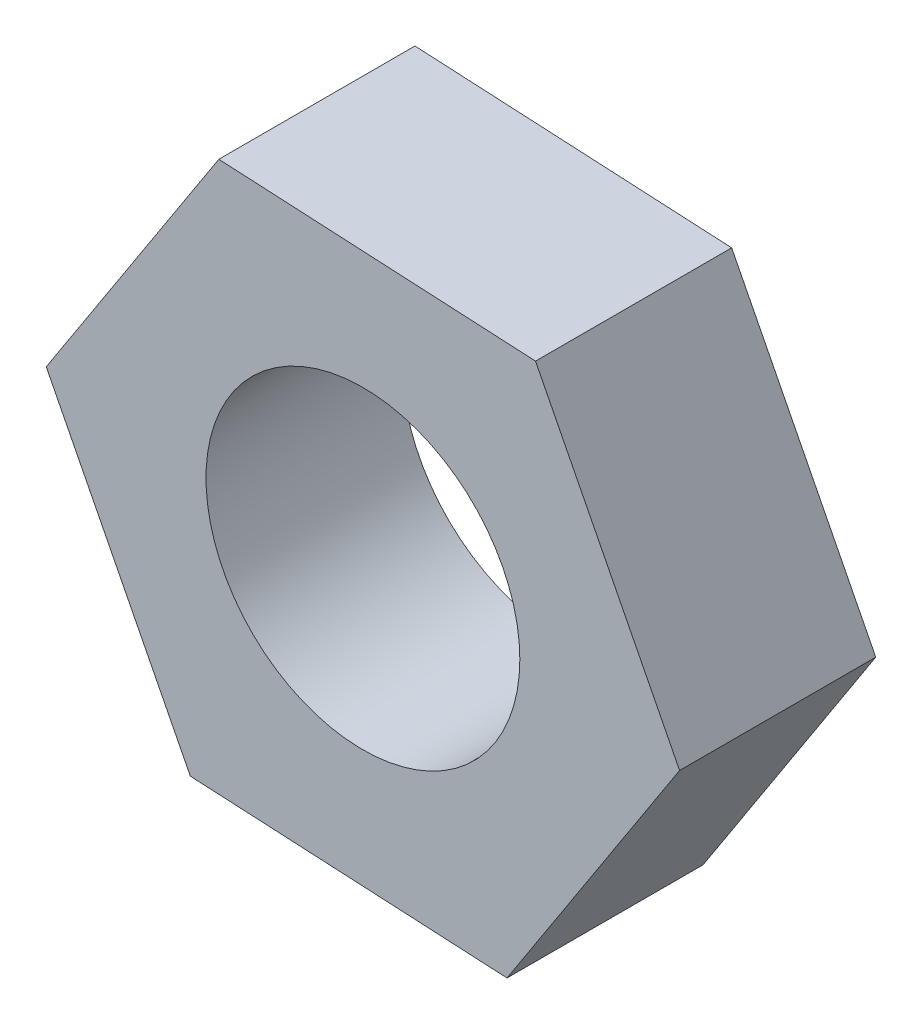
ISO-10303-21;
HEADER;
FILE_DESCRIPTION(('STEP AP214'),'2;1');
FILE_NAME('part.step','',(''),(''),'','','');
FILE_SCHEMA(('AUTOMOTIVE_DESIGN { 1 0 10303 214 1 1 1 1 }'));
ENDSEC;
DATA;
#1=APPLICATION_CONTEXT('core data for automotive mechanical design processes');
#2=APPLICATION_PROTOCOL_DEFINITION('international standard','automotive_design',2000,#1);
#3=PRODUCT_CONTEXT('',#1,'mechanical');
#4=PRODUCT('Part','Part','',(#3));
#5=PRODUCT_RELATED_PRODUCT_CATEGORY('part','',(#4));
#6=PRODUCT_DEFINITION_FORMATION('','',#4);
#7=PRODUCT_DEFINITION_CONTEXT('part definition',#1,'design');
#8=PRODUCT_DEFINITION('design','',#6,#7);
#9=PRODUCT_DEFINITION_SHAPE('','',#8);
#10=(LENGTH_UNIT() NAMED_UNIT(*) SI_UNIT(.MILLI.,.METRE.));
#11=(NAMED_UNIT(*) PLANE_ANGLE_UNIT() SI_UNIT($,.RADIAN.));
#12=(NAMED_UNIT(*) SI_UNIT($,.STERADIAN.) SOLID_ANGLE_UNIT());
#13=UNCERTAINTY_MEASURE_WITH_UNIT(LENGTH_MEASURE(1.E-05),#10,'distance_accuracy_value','');
#14=(GEOMETRIC_REPRESENTATION_CONTEXT(3) GLOBAL_UNCERTAINTY_ASSIGNED_CONTEXT((#13)) GLOBAL_UNIT_ASSIGNED_CONTEXT((#10,
#11,#12)) REPRESENTATION_CONTEXT('',''));
#15=CARTESIAN_POINT('',(0.,0.,0.));
#16=DIRECTION('',(0.,0.,1.));
#17=DIRECTION('',(1.,0.,0.));
#18=AXIS2_PLACEMENT_3D('',#15,#16,#17);
#19=CARTESIAN_POINT('',(4.03600614441625,-0.209732533402794,2.5));
#20=DIRECTION('',(-0.890806131221612,-0.454383578684337,0.));
#21=DIRECTION('',(0.454383578684337,-0.890806131221612,0.));
#22=AXIS2_PLACEMENT_3D('',#19,#20,#21);
#23=PLANE('',#22);
#24=DIRECTION('',(-0.454383578684337,0.890806131221612,0.));
#25=VECTOR('',#24,1.);
#26=CARTESIAN_POINT('',(4.03600614441625,-0.209732533402794,0.));
#27=LINE('',#26,#25);
#28=CARTESIAN_POINT('',(4.03600614441625,-0.209732533402794,0.));
#29=VERTEX_POINT('',#28);
#30=CARTESIAN_POINT('',(2.19963677413502,3.39041758419316,0.));
#31=VERTEX_POINT('',#30);
#32=EDGE_CURVE('E85',#29,#31,#27,.T.);
#33=ORIENTED_EDGE('',*,*,#32,.T.);
#34=DIRECTION('',(0.,0.,-1.));
#35=VECTOR('',#34,1.);
#36=CARTESIAN_POINT('',(2.19963677413502,3.39041758419316,2.5));
#37=LINE('',#36,#35);
#38=CARTESIAN_POINT('',(2.19963677413502,3.39041758419316,2.5));
#39=VERTEX_POINT('',#38);
#40=EDGE_CURVE('E11',#39,#31,#37,.T.);
#41=ORIENTED_EDGE('',*,*,#40,.F.);
#42=DIRECTION('',(-0.454383578684337,0.890806131221612,0.));
#43=VECTOR('',#42,1.);
#44=CARTESIAN_POINT('',(4.03600614441625,-0.209732533402794,2.5));
#45=LINE('',#44,#43);
#46=CARTESIAN_POINT('',(4.03600614441625,-0.209732533402794,2.5));
#47=VERTEX_POINT('',#46);
#48=EDGE_CURVE('E113',#47,#39,#45,.T.);
#49=ORIENTED_EDGE('',*,*,#48,.F.);
#50=DIRECTION('',(0.,0.,-1.));
#51=VECTOR('',#50,1.);
#52=CARTESIAN_POINT('',(4.03600614441625,-0.209732533402794,2.5));
#53=LINE('',#52,#51);
#54=EDGE_CURVE('E98',#47,#29,#53,.T.);
#55=ORIENTED_EDGE('',*,*,#54,.T.);
#56=EDGE_LOOP('',(#33,#41,#49,#55));
#57=FACE_BOUND('',#56,.T.);
#58=ADVANCED_FACE('F29',(#57),#23,.F.);
#59=CARTESIAN_POINT('',(2.19963677413502,3.39041758419316,2.5));
#60=DIRECTION('',(-0.0518953434076843,-0.998652528827018,0.));
#61=DIRECTION('',(0.998652528827018,-0.0518953434076843,0.));
#62=AXIS2_PLACEMENT_3D('',#59,#60,#61);
#63=PLANE('',#62);
#64=DIRECTION('',(-0.998652528827018,0.0518953434076843,0.));
#65=VECTOR('',#64,1.);
#66=CARTESIAN_POINT('',(2.19963677413502,3.39041758419316,0.));
#67=LINE('',#66,#65);
#68=CARTESIAN_POINT('',(-1.83636937028123,3.60015011759596,0.));
#69=VERTEX_POINT('',#68);
#70=EDGE_CURVE('E81',#31,#69,#67,.T.);
#71=ORIENTED_EDGE('',*,*,#70,.T.);
#72=DIRECTION('',(0.,0.,-1.));
#73=VECTOR('',#72,1.);
#74=CARTESIAN_POINT('',(-1.83636937028123,3.60015011759596,2.5));
#75=LINE('',#74,#73);
#76=CARTESIAN_POINT('',(-1.83636937028123,3.60015011759596,2.5));
#77=VERTEX_POINT('',#76);
#78=EDGE_CURVE('E36',#77,#69,#75,.T.);
#79=ORIENTED_EDGE('',*,*,#78,.F.);
#80=DIRECTION('',(-0.998652528827018,0.0518953434076843,0.));
#81=VECTOR('',#80,1.);
#82=CARTESIAN_POINT('',(2.19963677413502,3.39041758419316,2.5));
#83=LINE('',#82,#81);
#84=EDGE_CURVE('E94',#39,#77,#83,.T.);
#85=ORIENTED_EDGE('',*,*,#84,.F.);
#86=ORIENTED_EDGE('',*,*,#40,.T.);
#87=EDGE_LOOP('',(#71,#79,#85,#86));
#88=FACE_BOUND('',#87,.T.);
#89=ADVANCED_FACE('F93',(#88),#63,.F.);
#90=CARTESIAN_POINT('',(-1.83636937028123,3.60015011759596,2.5));
#91=DIRECTION('',(0.838910787813927,-0.544268950142681,0.));
#92=DIRECTION('',(0.544268950142681,0.838910787813927,0.));
#93=AXIS2_PLACEMENT_3D('',#90,#91,#92);
#94=PLANE('',#93);
#95=DIRECTION('',(-0.544268950142681,-0.838910787813927,0.));
#96=VECTOR('',#95,1.);
#97=CARTESIAN_POINT('',(-1.83636937028123,3.60015011759596,0.));
#98=LINE('',#97,#96);
#99=CARTESIAN_POINT('',(-4.03600614441625,0.209732533402808,0.));
#100=VERTEX_POINT('',#99);
#101=EDGE_CURVE('E87',#69,#100,#98,.T.);
#102=ORIENTED_EDGE('',*,*,#101,.T.);
#103=DIRECTION('',(0.,0.,-1.));
#104=VECTOR('',#103,1.);
#105=CARTESIAN_POINT('',(-4.03600614441625,0.209732533402808,2.5));
#106=LINE('',#105,#104);
#107=CARTESIAN_POINT('',(-4.03600614441625,0.209732533402808,2.5));
#108=VERTEX_POINT('',#107);
#109=EDGE_CURVE('E129',#108,#100,#106,.T.);
#110=ORIENTED_EDGE('',*,*,#109,.F.);
#111=DIRECTION('',(-0.544268950142681,-0.838910787813927,0.));
#112=VECTOR('',#111,1.);
#113=CARTESIAN_POINT('',(-1.83636937028123,3.60015011759596,2.5));
#114=LINE('',#113,#112);
#115=EDGE_CURVE('E116',#77,#108,#114,.T.);
#116=ORIENTED_EDGE('',*,*,#115,.F.);
#117=ORIENTED_EDGE('',*,*,#78,.T.);
#118=EDGE_LOOP('',(#102,#110,#116,#117));
#119=FACE_BOUND('',#118,.T.);
#120=ADVANCED_FACE('F133',(#119),#94,.F.);
#121=CARTESIAN_POINT('',(-4.03600614441625,0.209732533402808,2.5));
#122=DIRECTION('',(0.890806131221612,0.454383578684337,0.));
#123=DIRECTION('',(-0.454383578684337,0.890806131221612,0.));
#124=AXIS2_PLACEMENT_3D('',#121,#122,#123);
#125=PLANE('',#124);
#126=DIRECTION('',(0.454383578684337,-0.890806131221612,0.));
#127=VECTOR('',#126,1.);
#128=CARTESIAN_POINT('',(-4.03600614441625,0.209732533402808,0.));
#129=LINE('',#128,#127);
#130=CARTESIAN_POINT('',(-2.19963677413502,-3.39041758419316,0.));
#131=VERTEX_POINT('',#130);
#132=EDGE_CURVE('E107',#100,#131,#129,.T.);
#133=ORIENTED_EDGE('',*,*,#132,.T.);
#134=DIRECTION('',(0.,0.,-1.));
#135=VECTOR('',#134,1.);
#136=CARTESIAN_POINT('',(-2.19963677413502,-3.39041758419316,2.5));
#137=LINE('',#136,#135);
#138=CARTESIAN_POINT('',(-2.19963677413502,-3.39041758419316,2.5));
#139=VERTEX_POINT('',#138);
#140=EDGE_CURVE('E126',#139,#131,#137,.T.);
#141=ORIENTED_EDGE('',*,*,#140,.F.);
#142=DIRECTION('',(0.454383578684337,-0.890806131221612,0.));
#143=VECTOR('',#142,1.);
#144=CARTESIAN_POINT('',(-4.03600614441625,0.209732533402808,2.5));
#145=LINE('',#144,#143);
#146=EDGE_CURVE('E118',#108,#139,#145,.T.);
#147=ORIENTED_EDGE('',*,*,#146,.F.);
#148=ORIENTED_EDGE('',*,*,#109,.T.);
#149=EDGE_LOOP('',(#133,#141,#147,#148));
#150=FACE_BOUND('',#149,.T.);
#151=ADVANCED_FACE('F139',(#150),#125,.F.);
#152=CARTESIAN_POINT('',(-2.19963677413502,-3.39041758419316,2.5));
#153=DIRECTION('',(0.0518953434076844,0.998652528827018,0.));
#154=DIRECTION('',(-0.998652528827018,0.0518953434076844,0.));
#155=AXIS2_PLACEMENT_3D('',#152,#153,#154);
#156=PLANE('',#155);
#157=DIRECTION('',(0.998652528827018,-0.0518953434076844,0.));
#158=VECTOR('',#157,1.);
#159=CARTESIAN_POINT('',(-2.19963677413502,-3.39041758419316,0.));
#160=LINE('',#159,#158);
#161=CARTESIAN_POINT('',(1.83636937028122,-3.60015011759596,0.));
#162=VERTEX_POINT('',#161);
#163=EDGE_CURVE('E109',#131,#162,#160,.T.);
#164=ORIENTED_EDGE('',*,*,#163,.T.);
#165=DIRECTION('',(0.,0.,-1.));
#166=VECTOR('',#165,1.);
#167=CARTESIAN_POINT('',(1.83636937028122,-3.60015011759596,2.5));
#168=LINE('',#167,#166);
#169=CARTESIAN_POINT('',(1.83636937028122,-3.60015011759596,2.5));
#170=VERTEX_POINT('',#169);
#171=EDGE_CURVE('E123',#170,#162,#168,.T.);
#172=ORIENTED_EDGE('',*,*,#171,.F.);
#173=DIRECTION('',(0.998652528827018,-0.0518953434076844,0.));
#174=VECTOR('',#173,1.);
#175=CARTESIAN_POINT('',(-2.19963677413502,-3.39041758419316,2.5));
#176=LINE('',#175,#174);
#177=EDGE_CURVE('E48',#139,#170,#176,.T.);
#178=ORIENTED_EDGE('',*,*,#177,.F.);
#179=ORIENTED_EDGE('',*,*,#140,.T.);
#180=EDGE_LOOP('',(#164,#172,#178,#179));
#181=FACE_BOUND('',#180,.T.);
#182=ADVANCED_FACE('F142',(#181),#156,.F.);
#183=CARTESIAN_POINT('',(1.83636937028122,-3.60015011759596,2.5));
#184=DIRECTION('',(-0.838910787813927,0.544268950142682,0.));
#185=DIRECTION('',(-0.544268950142682,-0.838910787813927,0.));
#186=AXIS2_PLACEMENT_3D('',#183,#184,#185);
#187=PLANE('',#186);
#188=DIRECTION('',(0.544268950142682,0.838910787813927,0.));
#189=VECTOR('',#188,1.);
#190=CARTESIAN_POINT('',(1.83636937028122,-3.60015011759596,0.));
#191=LINE('',#190,#189);
#192=EDGE_CURVE('E111',#162,#29,#191,.T.);
#193=ORIENTED_EDGE('',*,*,#192,.T.);
#194=ORIENTED_EDGE('',*,*,#54,.F.);
#195=DIRECTION('',(0.544268950142682,0.838910787813927,0.));
#196=VECTOR('',#195,1.);
#197=CARTESIAN_POINT('',(1.83636937028122,-3.60015011759596,2.5));
#198=LINE('',#197,#196);
#199=EDGE_CURVE('E43',#170,#47,#198,.T.);
#200=ORIENTED_EDGE('',*,*,#199,.F.);
#201=ORIENTED_EDGE('',*,*,#171,.T.);
#202=EDGE_LOOP('',(#193,#194,#200,#201));
#203=FACE_BOUND('',#202,.T.);
#204=ADVANCED_FACE('F144',(#203),#187,.F.);
#205=CARTESIAN_POINT('',(4.03600614441625,-0.209732533402795,2.5));
#206=DIRECTION('',(0.,0.,-1.));
#207=DIRECTION('',(-1.,0.,0.));
#208=AXIS2_PLACEMENT_3D('',#205,#206,#207);
#209=PLANE('',#208);
#210=CARTESIAN_POINT('',(0.,0.,2.5));
#211=DIRECTION('',(0.,0.,1.));
#212=DIRECTION('',(1.,0.,0.));
#213=AXIS2_PLACEMENT_3D('',#210,#211,#212);
#214=CIRCLE('',#213,2.);
#215=CARTESIAN_POINT('',(2.,0.,2.5));
#216=VERTEX_POINT('',#215);
#217=EDGE_CURVE('E102',#216,#216,#214,.T.);
#218=ORIENTED_EDGE('',*,*,#217,.F.);
#219=EDGE_LOOP('',(#218));
#220=FACE_BOUND('',#219,.T.);
#221=ORIENTED_EDGE('',*,*,#48,.T.);
#222=ORIENTED_EDGE('',*,*,#84,.T.);
#223=ORIENTED_EDGE('',*,*,#115,.T.);
#224=ORIENTED_EDGE('',*,*,#146,.T.);
#225=ORIENTED_EDGE('',*,*,#177,.T.);
#226=ORIENTED_EDGE('',*,*,#199,.T.);
#227=EDGE_LOOP('',(#221,#222,#223,#224,#225,#226));
#228=FACE_BOUND('',#227,.T.);
#229=ADVANCED_FACE('F136',(#220,#228),#209,.F.);
#230=CARTESIAN_POINT('',(4.03600614441625,-0.209732533402795,0.));
#231=DIRECTION('',(0.,0.,-1.));
#232=DIRECTION('',(-1.,0.,0.));
#233=AXIS2_PLACEMENT_3D('',#230,#231,#232);
#234=PLANE('',#233);
#235=CARTESIAN_POINT('',(0.,0.,0.));
#236=DIRECTION('',(0.,0.,1.));
#237=DIRECTION('',(1.,0.,0.));
#238=AXIS2_PLACEMENT_3D('',#235,#236,#237);
#239=CIRCLE('',#238,2.);
#240=CARTESIAN_POINT('',(2.,0.,0.));
#241=VERTEX_POINT('',#240);
#242=EDGE_CURVE('E99',#241,#241,#239,.T.);
#243=ORIENTED_EDGE('',*,*,#242,.T.);
#244=EDGE_LOOP('',(#243));
#245=FACE_BOUND('',#244,.T.);
#246=ORIENTED_EDGE('',*,*,#32,.F.);
#247=ORIENTED_EDGE('',*,*,#192,.F.);
#248=ORIENTED_EDGE('',*,*,#163,.F.);
#249=ORIENTED_EDGE('',*,*,#132,.F.);
#250=ORIENTED_EDGE('',*,*,#101,.F.);
#251=ORIENTED_EDGE('',*,*,#70,.F.);
#252=EDGE_LOOP('',(#246,#247,#248,#249,#250,#251));
#253=FACE_BOUND('',#252,.T.);
#254=ADVANCED_FACE('F82',(#245,#253),#234,.T.);
#255=CARTESIAN_POINT('',(0.,0.,0.));
#256=DIRECTION('',(0.,0.,1.));
#257=DIRECTION('',(1.,0.,0.));
#258=AXIS2_PLACEMENT_3D('',#255,#256,#257);
#259=CYLINDRICAL_SURFACE('',#258,2.);
#260=ORIENTED_EDGE('',*,*,#242,.F.);
#261=EDGE_LOOP('',(#260));
#262=FACE_BOUND('',#261,.T.);
#263=ORIENTED_EDGE('',*,*,#217,.T.);
#264=EDGE_LOOP('',(#263));
#265=FACE_BOUND('',#264,.T.);
#266=ADVANCED_FACE('F191',(#262,#265),#259,.F.);
#267=CLOSED_SHELL('',(#58,#89,#120,#151,#182,#204,#229,#254,#266));
#268=MANIFOLD_SOLID_BREP('B2',#267);
#269=ADVANCED_BREP_SHAPE_REPRESENTATION('',(#18,#268),#14);
#270=SHAPE_DEFINITION_REPRESENTATION(#9,#269);
ENDSEC;
END-ISO-10303-21;
